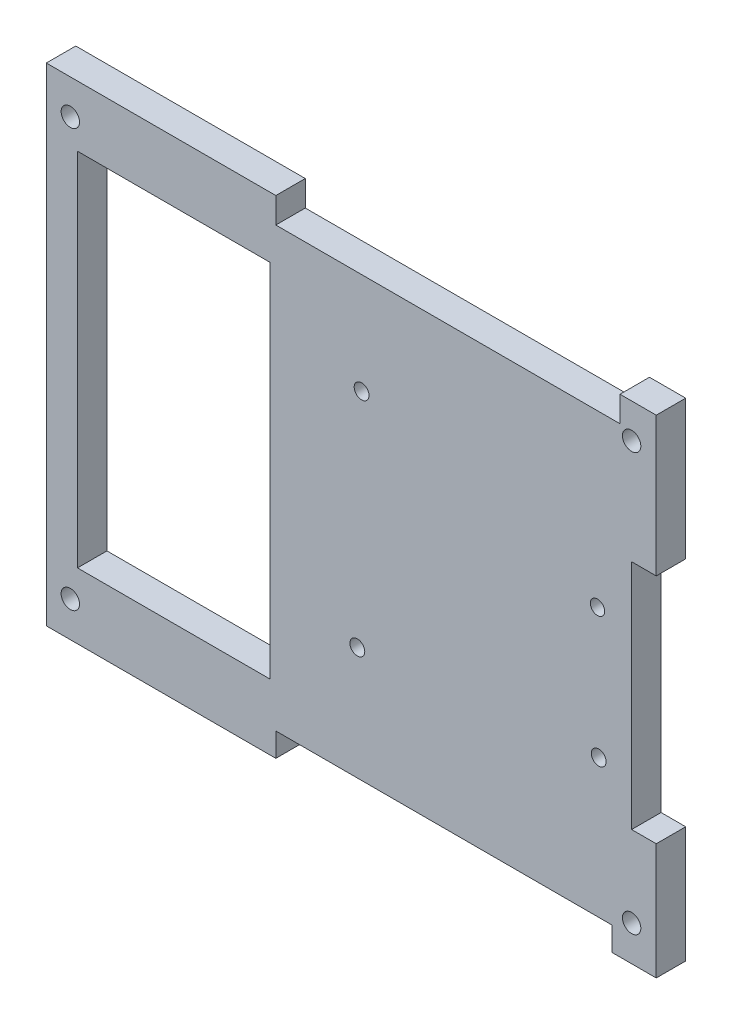
ISO-10303-21;
HEADER;
FILE_DESCRIPTION(('STEP AP214'),'2;1');
FILE_NAME('part.step','',(''),(''),'','','');
FILE_SCHEMA(('AUTOMOTIVE_DESIGN { 1 0 10303 214 1 1 1 1 }'));
ENDSEC;
DATA;
#1=APPLICATION_CONTEXT('core data for automotive mechanical design processes');
#2=APPLICATION_PROTOCOL_DEFINITION('international standard','automotive_design',2000,#1);
#3=PRODUCT_CONTEXT('',#1,'mechanical');
#4=PRODUCT('Part','Part','',(#3));
#5=PRODUCT_RELATED_PRODUCT_CATEGORY('part','',(#4));
#6=PRODUCT_DEFINITION_FORMATION('','',#4);
#7=PRODUCT_DEFINITION_CONTEXT('part definition',#1,'design');
#8=PRODUCT_DEFINITION('design','',#6,#7);
#9=PRODUCT_DEFINITION_SHAPE('','',#8);
#10=(LENGTH_UNIT() NAMED_UNIT(*) SI_UNIT(.MILLI.,.METRE.));
#11=(NAMED_UNIT(*) PLANE_ANGLE_UNIT() SI_UNIT($,.RADIAN.));
#12=(NAMED_UNIT(*) SI_UNIT($,.STERADIAN.) SOLID_ANGLE_UNIT());
#13=UNCERTAINTY_MEASURE_WITH_UNIT(LENGTH_MEASURE(1.E-05),#10,'distance_accuracy_value','');
#14=(GEOMETRIC_REPRESENTATION_CONTEXT(3) GLOBAL_UNCERTAINTY_ASSIGNED_CONTEXT((#13)) GLOBAL_UNIT_ASSIGNED_CONTEXT((#10,
#11,#12)) REPRESENTATION_CONTEXT('',''));
#15=CARTESIAN_POINT('',(0.,0.,0.));
#16=DIRECTION('',(0.,0.,1.));
#17=DIRECTION('',(1.,0.,0.));
#18=AXIS2_PLACEMENT_3D('',#15,#16,#17);
#19=CARTESIAN_POINT('',(418.178448875835,816.186975900284,1338.37384360341));
#20=DIRECTION('',(0.,1.,0.));
#21=DIRECTION('',(0.,0.,1.));
#22=AXIS2_PLACEMENT_3D('',#19,#20,#21);
#23=PLANE('',#22);
#24=DIRECTION('',(1.,0.,0.));
#25=VECTOR('',#24,1.);
#26=CARTESIAN_POINT('',(418.178448875835,816.186975900284,1338.37384360341));
#27=LINE('',#26,#25);
#28=CARTESIAN_POINT('',(540.159575683656,816.186975900284,1338.37384360341));
#29=VERTEX_POINT('',#28);
#30=CARTESIAN_POINT('',(549.669350228509,816.186975900284,1338.37384360341));
#31=VERTEX_POINT('',#30);
#32=EDGE_CURVE('E413',#29,#31,#27,.T.);
#33=ORIENTED_EDGE('',*,*,#32,.F.);
#34=DIRECTION('',(0.,0.,1.));
#35=VECTOR('',#34,1.);
#36=CARTESIAN_POINT('',(540.159575683656,816.186975900284,1332.02384360341));
#37=LINE('',#36,#35);
#38=CARTESIAN_POINT('',(540.159575683656,816.186975900284,1332.02384360341));
#39=VERTEX_POINT('',#38);
#40=EDGE_CURVE('E244',#39,#29,#37,.T.);
#41=ORIENTED_EDGE('',*,*,#40,.F.);
#42=DIRECTION('',(1.,0.,0.));
#43=VECTOR('',#42,1.);
#44=CARTESIAN_POINT('',(418.178448875835,816.186975900284,1332.02384360341));
#45=LINE('',#44,#43);
#46=CARTESIAN_POINT('',(549.669350228509,816.186975900284,1332.02384360341));
#47=VERTEX_POINT('',#46);
#48=EDGE_CURVE('E433',#39,#47,#45,.T.);
#49=ORIENTED_EDGE('',*,*,#48,.T.);
#50=DIRECTION('',(0.,0.,-1.));
#51=VECTOR('',#50,1.);
#52=CARTESIAN_POINT('',(549.669350228509,816.186975900284,1338.37384360341));
#53=LINE('',#52,#51);
#54=EDGE_CURVE('E54',#31,#47,#53,.T.);
#55=ORIENTED_EDGE('',*,*,#54,.F.);
#56=EDGE_LOOP('',(#33,#41,#49,#55));
#57=FACE_BOUND('',#56,.T.);
#58=ADVANCED_FACE('F45',(#57),#23,.F.);
#59=CARTESIAN_POINT('',(549.669350228509,921.270351797214,1338.37384360341));
#60=DIRECTION('',(-1.,0.,0.));
#61=DIRECTION('',(0.,0.,1.));
#62=AXIS2_PLACEMENT_3D('',#59,#60,#61);
#63=PLANE('',#62);
#64=DIRECTION('',(0.,1.,0.));
#65=VECTOR('',#64,1.);
#66=CARTESIAN_POINT('',(549.669350228509,921.270351797214,1332.02384360341));
#67=LINE('',#66,#65);
#68=CARTESIAN_POINT('',(549.669350228509,841.251573063495,1332.02384360341));
#69=VERTEX_POINT('',#68);
#70=EDGE_CURVE('E439',#47,#69,#67,.T.);
#71=ORIENTED_EDGE('',*,*,#70,.T.);
#72=DIRECTION('',(0.,0.,1.));
#73=VECTOR('',#72,1.);
#74=CARTESIAN_POINT('',(549.669350228509,841.251573063495,1332.02384360341));
#75=LINE('',#74,#73);
#76=CARTESIAN_POINT('',(549.669350228509,841.251573063495,1338.37384360341));
#77=VERTEX_POINT('',#76);
#78=EDGE_CURVE('E278',#69,#77,#75,.T.);
#79=ORIENTED_EDGE('',*,*,#78,.T.);
#80=DIRECTION('',(0.,1.,0.));
#81=VECTOR('',#80,1.);
#82=CARTESIAN_POINT('',(549.669350228509,921.270351797214,1338.37384360341));
#83=LINE('',#82,#81);
#84=EDGE_CURVE('E420',#31,#77,#83,.T.);
#85=ORIENTED_EDGE('',*,*,#84,.F.);
#86=ORIENTED_EDGE('',*,*,#54,.T.);
#87=EDGE_LOOP('',(#71,#79,#85,#86));
#88=FACE_BOUND('',#87,.T.);
#89=ADVANCED_FACE('F458',(#88),#63,.F.);
#90=CARTESIAN_POINT('',(418.178448875835,921.270351797214,1338.37384360341));
#91=DIRECTION('',(0.,-1.,0.));
#92=DIRECTION('',(0.,0.,-1.));
#93=AXIS2_PLACEMENT_3D('',#90,#91,#92);
#94=PLANE('',#93);
#95=DIRECTION('',(-1.,0.,0.));
#96=VECTOR('',#95,1.);
#97=CARTESIAN_POINT('',(418.178448875835,921.270351797214,1338.37384360341));
#98=LINE('',#97,#96);
#99=CARTESIAN_POINT('',(467.658620616941,921.270351797214,1338.37384360341));
#100=VERTEX_POINT('',#99);
#101=CARTESIAN_POINT('',(418.178448875835,921.270351797214,1338.37384360341));
#102=VERTEX_POINT('',#101);
#103=EDGE_CURVE('E424',#100,#102,#98,.T.);
#104=ORIENTED_EDGE('',*,*,#103,.F.);
#105=DIRECTION('',(0.,0.,1.));
#106=VECTOR('',#105,1.);
#107=CARTESIAN_POINT('',(467.658620616941,921.270351797214,1332.02384360341));
#108=LINE('',#107,#106);
#109=CARTESIAN_POINT('',(467.658620616941,921.270351797214,1332.02384360341));
#110=VERTEX_POINT('',#109);
#111=EDGE_CURVE('E224',#110,#100,#108,.T.);
#112=ORIENTED_EDGE('',*,*,#111,.F.);
#113=DIRECTION('',(-1.,0.,0.));
#114=VECTOR('',#113,1.);
#115=CARTESIAN_POINT('',(418.178448875835,921.270351797214,1332.02384360341));
#116=LINE('',#115,#114);
#117=CARTESIAN_POINT('',(418.178448875835,921.270351797214,1332.02384360341));
#118=VERTEX_POINT('',#117);
#119=EDGE_CURVE('E209',#110,#118,#116,.T.);
#120=ORIENTED_EDGE('',*,*,#119,.T.);
#121=DIRECTION('',(0.,0.,-1.));
#122=VECTOR('',#121,1.);
#123=CARTESIAN_POINT('',(418.178448875835,921.270351797214,1338.37384360341));
#124=LINE('',#123,#122);
#125=EDGE_CURVE('E429',#102,#118,#124,.T.);
#126=ORIENTED_EDGE('',*,*,#125,.F.);
#127=EDGE_LOOP('',(#104,#112,#120,#126));
#128=FACE_BOUND('',#127,.T.);
#129=ADVANCED_FACE('F494',(#128),#94,.F.);
#130=CARTESIAN_POINT('',(0.,0.,1338.37384360341));
#131=DIRECTION('',(0.,0.,1.));
#132=DIRECTION('',(1.,0.,0.));
#133=AXIS2_PLACEMENT_3D('',#130,#131,#132);
#134=PLANE('',#133);
#135=DIRECTION('',(0.,-1.,0.));
#136=VECTOR('',#135,1.);
#137=CARTESIAN_POINT('',(467.658620616941,921.270351797214,1338.37384360341));
#138=LINE('',#137,#136);
#139=CARTESIAN_POINT('',(467.658620616941,915.761022469148,1338.37384360341));
#140=VERTEX_POINT('',#139);
#141=EDGE_CURVE('E189',#100,#140,#138,.T.);
#142=ORIENTED_EDGE('',*,*,#141,.F.);
#143=ORIENTED_EDGE('',*,*,#103,.T.);
#144=DIRECTION('',(0.,-1.,0.));
#145=VECTOR('',#144,1.);
#146=CARTESIAN_POINT('',(418.178448875835,921.270351797214,1338.37384360341));
#147=LINE('',#146,#145);
#148=CARTESIAN_POINT('',(418.178448875835,816.186975900284,1338.37384360341));
#149=VERTEX_POINT('',#148);
#150=EDGE_CURVE('E409',#102,#149,#147,.T.);
#151=ORIENTED_EDGE('',*,*,#150,.T.);
#152=CARTESIAN_POINT('',(467.658063855424,816.186975900284,1338.37384360341));
#153=VERTEX_POINT('',#152);
#154=EDGE_CURVE('E415',#149,#153,#27,.T.);
#155=ORIENTED_EDGE('',*,*,#154,.T.);
#156=DIRECTION('',(0.,-1.,0.));
#157=VECTOR('',#156,1.);
#158=CARTESIAN_POINT('',(467.658063855424,816.186975900284,1338.37384360341));
#159=LINE('',#158,#157);
#160=CARTESIAN_POINT('',(467.658063855424,821.303733140852,1338.37384360341));
#161=VERTEX_POINT('',#160);
#162=EDGE_CURVE('E61',#161,#153,#159,.T.);
#163=ORIENTED_EDGE('',*,*,#162,.F.);
#164=DIRECTION('',(-1.,0.,0.));
#165=VECTOR('',#164,1.);
#166=CARTESIAN_POINT('',(540.159575683656,821.303733140852,1338.37384360341));
#167=LINE('',#166,#165);
#168=CARTESIAN_POINT('',(540.159575683656,821.303733140852,1338.37384360341));
#169=VERTEX_POINT('',#168);
#170=EDGE_CURVE('E250',#169,#161,#167,.T.);
#171=ORIENTED_EDGE('',*,*,#170,.F.);
#172=DIRECTION('',(0.,1.,0.));
#173=VECTOR('',#172,1.);
#174=CARTESIAN_POINT('',(540.159575683656,816.186975900284,1338.37384360341));
#175=LINE('',#174,#173);
#176=EDGE_CURVE('E221',#29,#169,#175,.T.);
#177=ORIENTED_EDGE('',*,*,#176,.F.);
#178=ORIENTED_EDGE('',*,*,#32,.T.);
#179=ORIENTED_EDGE('',*,*,#84,.T.);
#180=DIRECTION('',(1.,0.,0.));
#181=VECTOR('',#180,1.);
#182=CARTESIAN_POINT('',(549.669350228509,841.251573063495,1338.37384360341));
#183=LINE('',#182,#181);
#184=CARTESIAN_POINT('',(544.362409583412,841.251573063495,1338.37384360341));
#185=VERTEX_POINT('',#184);
#186=EDGE_CURVE('E282',#185,#77,#183,.T.);
#187=ORIENTED_EDGE('',*,*,#186,.F.);
#188=DIRECTION('',(0.,-1.,0.));
#189=VECTOR('',#188,1.);
#190=CARTESIAN_POINT('',(544.362409583412,891.254919125506,1338.37384360341));
#191=LINE('',#190,#189);
#192=CARTESIAN_POINT('',(544.362409583412,891.254919125506,1338.37384360341));
#193=VERTEX_POINT('',#192);
#194=EDGE_CURVE('E285',#193,#185,#191,.T.);
#195=ORIENTED_EDGE('',*,*,#194,.F.);
#196=DIRECTION('',(-1.,0.,0.));
#197=VECTOR('',#196,1.);
#198=CARTESIAN_POINT('',(549.669350228509,891.254919125506,1338.37384360341));
#199=LINE('',#198,#197);
#200=CARTESIAN_POINT('',(549.669350228509,891.254919125506,1338.37384360341));
#201=VERTEX_POINT('',#200);
#202=EDGE_CURVE('E247',#201,#193,#199,.T.);
#203=ORIENTED_EDGE('',*,*,#202,.F.);
#204=CARTESIAN_POINT('',(549.669350228509,921.270351797214,1338.37384360341));
#205=VERTEX_POINT('',#204);
#206=EDGE_CURVE('E419',#201,#205,#83,.T.);
#207=ORIENTED_EDGE('',*,*,#206,.T.);
#208=CARTESIAN_POINT('',(541.859742046903,921.270351797214,1338.37384360341));
#209=VERTEX_POINT('',#208);
#210=EDGE_CURVE('E425',#205,#209,#98,.T.);
#211=ORIENTED_EDGE('',*,*,#210,.T.);
#212=DIRECTION('',(0.,1.,0.));
#213=VECTOR('',#212,1.);
#214=CARTESIAN_POINT('',(541.859742046903,921.270351797214,1338.37384360341));
#215=LINE('',#214,#213);
#216=CARTESIAN_POINT('',(541.859742046903,915.761022469148,1338.37384360341));
#217=VERTEX_POINT('',#216);
#218=EDGE_CURVE('E211',#217,#209,#215,.T.);
#219=ORIENTED_EDGE('',*,*,#218,.F.);
#220=DIRECTION('',(1.,0.,0.));
#221=VECTOR('',#220,1.);
#222=CARTESIAN_POINT('',(467.658620616941,915.761022469148,1338.37384360341));
#223=LINE('',#222,#221);
#224=EDGE_CURVE('E214',#140,#217,#223,.T.);
#225=ORIENTED_EDGE('',*,*,#224,.F.);
#226=EDGE_LOOP('',(#142,#143,#151,#155,#163,#171,#177,#178,#179,#187,#195,#203,#207,#211,#219,#225));
#227=FACE_BOUND('',#226,.T.);
#228=DIRECTION('',(0.,1.,0.));
#229=VECTOR('',#228,1.);
#230=CARTESIAN_POINT('',(466.43603761745,908.167213591682,1338.37384360341));
#231=LINE('',#230,#229);
#232=CARTESIAN_POINT('',(466.43603761745,830.367055643005,1338.37384360341));
#233=VERTEX_POINT('',#232);
#234=CARTESIAN_POINT('',(466.43603761745,908.167213591682,1338.37384360341));
#235=VERTEX_POINT('',#234);
#236=EDGE_CURVE('E227',#233,#235,#231,.T.);
#237=ORIENTED_EDGE('',*,*,#236,.F.);
#238=DIRECTION('',(1.,0.,0.));
#239=VECTOR('',#238,1.);
#240=CARTESIAN_POINT('',(466.43603761745,830.367055643005,1338.37384360341));
#241=LINE('',#240,#239);
#242=CARTESIAN_POINT('',(424.903622471915,830.367055643005,1338.37384360341));
#243=VERTEX_POINT('',#242);
#244=EDGE_CURVE('E306',#243,#233,#241,.T.);
#245=ORIENTED_EDGE('',*,*,#244,.F.);
#246=DIRECTION('',(0.,-1.,0.));
#247=VECTOR('',#246,1.);
#248=CARTESIAN_POINT('',(424.903622471915,908.167213591682,1338.37384360341));
#249=LINE('',#248,#247);
#250=CARTESIAN_POINT('',(424.903622471915,908.167213591682,1338.37384360341));
#251=VERTEX_POINT('',#250);
#252=EDGE_CURVE('E325',#251,#243,#249,.T.);
#253=ORIENTED_EDGE('',*,*,#252,.F.);
#254=DIRECTION('',(-1.,0.,0.));
#255=VECTOR('',#254,1.);
#256=CARTESIAN_POINT('',(466.43603761745,908.167213591682,1338.37384360341));
#257=LINE('',#256,#255);
#258=EDGE_CURVE('E321',#235,#251,#257,.T.);
#259=ORIENTED_EDGE('',*,*,#258,.F.);
#260=EDGE_LOOP('',(#237,#245,#253,#259));
#261=FACE_BOUND('',#260,.T.);
#262=CARTESIAN_POINT('',(486.149027751431,893.958307233594,1338.37384360341));
#263=DIRECTION('',(0.,0.,1.));
#264=DIRECTION('',(1.,0.,0.));
#265=AXIS2_PLACEMENT_3D('',#262,#263,#264);
#266=CIRCLE('',#265,1.60000000000005);
#267=CARTESIAN_POINT('',(487.749027751431,893.958307233594,1338.37384360341));
#268=VERTEX_POINT('',#267);
#269=EDGE_CURVE('E350',#268,#268,#266,.T.);
#270=ORIENTED_EDGE('',*,*,#269,.F.);
#271=EDGE_LOOP('',(#270));
#272=FACE_BOUND('',#271,.T.);
#273=CARTESIAN_POINT('',(537.005692703363,879.063667595093,1338.37384360341));
#274=DIRECTION('',(0.,0.,1.));
#275=DIRECTION('',(1.,0.,0.));
#276=AXIS2_PLACEMENT_3D('',#273,#274,#275);
#277=CIRCLE('',#276,1.54077000260033);
#278=CARTESIAN_POINT('',(538.546462705964,879.063667595093,1338.37384360341));
#279=VERTEX_POINT('',#278);
#280=EDGE_CURVE('E354',#279,#279,#277,.T.);
#281=ORIENTED_EDGE('',*,*,#280,.F.);
#282=EDGE_LOOP('',(#281));
#283=FACE_BOUND('',#282,.T.);
#284=CARTESIAN_POINT('',(537.262931980679,851.150350094258,1338.37384360341));
#285=DIRECTION('',(0.,0.,1.));
#286=DIRECTION('',(1.,0.,0.));
#287=AXIS2_PLACEMENT_3D('',#284,#285,#286);
#288=CIRCLE('',#287,1.60000000000005);
#289=CARTESIAN_POINT('',(538.862931980679,851.150350094258,1338.37384360341));
#290=VERTEX_POINT('',#289);
#291=EDGE_CURVE('E362',#290,#290,#288,.T.);
#292=ORIENTED_EDGE('',*,*,#291,.F.);
#293=EDGE_LOOP('',(#292));
#294=FACE_BOUND('',#293,.T.);
#295=CARTESIAN_POINT('',(485.231408992538,845.690321199233,1338.37384360341));
#296=DIRECTION('',(0.,0.,1.));
#297=DIRECTION('',(1.,0.,0.));
#298=AXIS2_PLACEMENT_3D('',#295,#296,#297);
#299=CIRCLE('',#298,1.59999999999993);
#300=CARTESIAN_POINT('',(486.831408992538,845.690321199233,1338.37384360341));
#301=VERTEX_POINT('',#300);
#302=EDGE_CURVE('E370',#301,#301,#299,.T.);
#303=ORIENTED_EDGE('',*,*,#302,.F.);
#304=EDGE_LOOP('',(#303));
#305=FACE_BOUND('',#304,.T.);
#306=CARTESIAN_POINT('',(544.362409583412,823.802606664416,1338.37384360341));
#307=DIRECTION('',(0.,0.,1.));
#308=DIRECTION('',(1.,0.,0.));
#309=AXIS2_PLACEMENT_3D('',#306,#307,#308);
#310=CIRCLE('',#309,1.98119999999999);
#311=CARTESIAN_POINT('',(546.343609583412,823.802606664416,1338.37384360341));
#312=VERTEX_POINT('',#311);
#313=EDGE_CURVE('E385',#312,#312,#310,.T.);
#314=ORIENTED_EDGE('',*,*,#313,.F.);
#315=EDGE_LOOP('',(#314));
#316=FACE_BOUND('',#315,.T.);
#317=CARTESIAN_POINT('',(423.356809583412,913.820206664416,1338.37384360341));
#318=DIRECTION('',(0.,0.,1.));
#319=DIRECTION('',(1.,0.,0.));
#320=AXIS2_PLACEMENT_3D('',#317,#318,#319);
#321=CIRCLE('',#320,1.98119999999999);
#322=CARTESIAN_POINT('',(425.338009583412,913.820206664416,1338.37384360341));
#323=VERTEX_POINT('',#322);
#324=EDGE_CURVE('E401',#323,#323,#321,.T.);
#325=ORIENTED_EDGE('',*,*,#324,.F.);
#326=EDGE_LOOP('',(#325));
#327=FACE_BOUND('',#326,.T.);
#328=CARTESIAN_POINT('',(544.362409583412,913.820206664416,1338.37384360341));
#329=DIRECTION('',(0.,0.,1.));
#330=DIRECTION('',(1.,0.,0.));
#331=AXIS2_PLACEMENT_3D('',#328,#329,#330);
#332=CIRCLE('',#331,1.98119999999999);
#333=CARTESIAN_POINT('',(546.343609583412,913.820206664416,1338.37384360341));
#334=VERTEX_POINT('',#333);
#335=EDGE_CURVE('E393',#334,#334,#332,.T.);
#336=ORIENTED_EDGE('',*,*,#335,.F.);
#337=EDGE_LOOP('',(#336));
#338=FACE_BOUND('',#337,.T.);
#339=CARTESIAN_POINT('',(423.356809583412,823.802606664416,1338.37384360341));
#340=DIRECTION('',(0.,0.,1.));
#341=DIRECTION('',(1.,0.,0.));
#342=AXIS2_PLACEMENT_3D('',#339,#340,#341);
#343=CIRCLE('',#342,1.98119999999999);
#344=CARTESIAN_POINT('',(425.338009583412,823.802606664416,1338.37384360341));
#345=VERTEX_POINT('',#344);
#346=EDGE_CURVE('E377',#345,#345,#343,.T.);
#347=ORIENTED_EDGE('',*,*,#346,.F.);
#348=EDGE_LOOP('',(#347));
#349=FACE_BOUND('',#348,.T.);
#350=ADVANCED_FACE('F468',(#227,#261,#272,#283,#294,#305,#316,#327,#338,#349),#134,.T.);
#351=CARTESIAN_POINT('',(0.,0.,1332.02384360341));
#352=DIRECTION('',(0.,0.,1.));
#353=DIRECTION('',(1.,0.,0.));
#354=AXIS2_PLACEMENT_3D('',#351,#352,#353);
#355=PLANE('',#354);
#356=ORIENTED_EDGE('',*,*,#119,.F.);
#357=DIRECTION('',(0.,-1.,0.));
#358=VECTOR('',#357,1.);
#359=CARTESIAN_POINT('',(467.658620616941,921.270351797214,1332.02384360341));
#360=LINE('',#359,#358);
#361=CARTESIAN_POINT('',(467.658620616941,915.761022469148,1332.02384360341));
#362=VERTEX_POINT('',#361);
#363=EDGE_CURVE('E186',#110,#362,#360,.T.);
#364=ORIENTED_EDGE('',*,*,#363,.T.);
#365=DIRECTION('',(1.,0.,0.));
#366=VECTOR('',#365,1.);
#367=CARTESIAN_POINT('',(467.658620616941,915.761022469148,1332.02384360341));
#368=LINE('',#367,#366);
#369=CARTESIAN_POINT('',(541.859742046903,915.761022469148,1332.02384360341));
#370=VERTEX_POINT('',#369);
#371=EDGE_CURVE('E198',#362,#370,#368,.T.);
#372=ORIENTED_EDGE('',*,*,#371,.T.);
#373=DIRECTION('',(0.,1.,0.));
#374=VECTOR('',#373,1.);
#375=CARTESIAN_POINT('',(541.859742046903,921.270351797214,1332.02384360341));
#376=LINE('',#375,#374);
#377=CARTESIAN_POINT('',(541.859742046903,921.270351797214,1332.02384360341));
#378=VERTEX_POINT('',#377);
#379=EDGE_CURVE('E195',#370,#378,#376,.T.);
#380=ORIENTED_EDGE('',*,*,#379,.T.);
#381=CARTESIAN_POINT('',(549.669350228509,921.270351797214,1332.02384360341));
#382=VERTEX_POINT('',#381);
#383=EDGE_CURVE('E414',#382,#378,#116,.T.);
#384=ORIENTED_EDGE('',*,*,#383,.F.);
#385=CARTESIAN_POINT('',(549.669350228509,891.254919125506,1332.02384360341));
#386=VERTEX_POINT('',#385);
#387=EDGE_CURVE('E438',#386,#382,#67,.T.);
#388=ORIENTED_EDGE('',*,*,#387,.F.);
#389=DIRECTION('',(-1.,0.,0.));
#390=VECTOR('',#389,1.);
#391=CARTESIAN_POINT('',(549.669350228509,891.254919125506,1332.02384360341));
#392=LINE('',#391,#390);
#393=CARTESIAN_POINT('',(544.362409583412,891.254919125506,1332.02384360341));
#394=VERTEX_POINT('',#393);
#395=EDGE_CURVE('E69',#386,#394,#392,.T.);
#396=ORIENTED_EDGE('',*,*,#395,.T.);
#397=DIRECTION('',(0.,-1.,0.));
#398=VECTOR('',#397,1.);
#399=CARTESIAN_POINT('',(544.362409583412,891.254919125506,1332.02384360341));
#400=LINE('',#399,#398);
#401=CARTESIAN_POINT('',(544.362409583412,841.251573063495,1332.02384360341));
#402=VERTEX_POINT('',#401);
#403=EDGE_CURVE('E295',#394,#402,#400,.T.);
#404=ORIENTED_EDGE('',*,*,#403,.T.);
#405=DIRECTION('',(1.,0.,0.));
#406=VECTOR('',#405,1.);
#407=CARTESIAN_POINT('',(549.669350228509,841.251573063495,1332.02384360341));
#408=LINE('',#407,#406);
#409=EDGE_CURVE('E271',#402,#69,#408,.T.);
#410=ORIENTED_EDGE('',*,*,#409,.T.);
#411=ORIENTED_EDGE('',*,*,#70,.F.);
#412=ORIENTED_EDGE('',*,*,#48,.F.);
#413=DIRECTION('',(0.,1.,0.));
#414=VECTOR('',#413,1.);
#415=CARTESIAN_POINT('',(540.159575683656,816.186975900284,1332.02384360341));
#416=LINE('',#415,#414);
#417=CARTESIAN_POINT('',(540.159575683656,821.303733140852,1332.02384360341));
#418=VERTEX_POINT('',#417);
#419=EDGE_CURVE('E251',#39,#418,#416,.T.);
#420=ORIENTED_EDGE('',*,*,#419,.T.);
#421=DIRECTION('',(-1.,0.,0.));
#422=VECTOR('',#421,1.);
#423=CARTESIAN_POINT('',(540.159575683656,821.303733140852,1332.02384360341));
#424=LINE('',#423,#422);
#425=CARTESIAN_POINT('',(467.658063855424,821.303733140852,1332.02384360341));
#426=VERTEX_POINT('',#425);
#427=EDGE_CURVE('E261',#418,#426,#424,.T.);
#428=ORIENTED_EDGE('',*,*,#427,.T.);
#429=DIRECTION('',(0.,-1.,0.));
#430=VECTOR('',#429,1.);
#431=CARTESIAN_POINT('',(467.658063855424,816.186975900284,1332.02384360341));
#432=LINE('',#431,#430);
#433=CARTESIAN_POINT('',(467.658063855424,816.186975900284,1332.02384360341));
#434=VERTEX_POINT('',#433);
#435=EDGE_CURVE('E237',#426,#434,#432,.T.);
#436=ORIENTED_EDGE('',*,*,#435,.T.);
#437=CARTESIAN_POINT('',(418.178448875835,816.186975900284,1332.02384360341));
#438=VERTEX_POINT('',#437);
#439=EDGE_CURVE('E434',#438,#434,#45,.T.);
#440=ORIENTED_EDGE('',*,*,#439,.F.);
#441=DIRECTION('',(0.,-1.,0.));
#442=VECTOR('',#441,1.);
#443=CARTESIAN_POINT('',(418.178448875835,921.270351797214,1332.02384360341));
#444=LINE('',#443,#442);
#445=EDGE_CURVE('E405',#118,#438,#444,.T.);
#446=ORIENTED_EDGE('',*,*,#445,.F.);
#447=EDGE_LOOP('',(#356,#364,#372,#380,#384,#388,#396,#404,#410,#411,#412,#420,#428,#436,#440,#446));
#448=FACE_BOUND('',#447,.T.);
#449=DIRECTION('',(1.,0.,0.));
#450=VECTOR('',#449,1.);
#451=CARTESIAN_POINT('',(466.43603761745,830.367055643005,1332.02384360341));
#452=LINE('',#451,#450);
#453=CARTESIAN_POINT('',(424.903622471915,830.367055643005,1332.02384360341));
#454=VERTEX_POINT('',#453);
#455=CARTESIAN_POINT('',(466.43603761745,830.367055643005,1332.02384360341));
#456=VERTEX_POINT('',#455);
#457=EDGE_CURVE('E314',#454,#456,#452,.T.);
#458=ORIENTED_EDGE('',*,*,#457,.T.);
#459=DIRECTION('',(0.,1.,0.));
#460=VECTOR('',#459,1.);
#461=CARTESIAN_POINT('',(466.43603761745,908.167213591682,1332.02384360341));
#462=LINE('',#461,#460);
#463=CARTESIAN_POINT('',(466.43603761745,908.167213591682,1332.02384360341));
#464=VERTEX_POINT('',#463);
#465=EDGE_CURVE('E301',#456,#464,#462,.T.);
#466=ORIENTED_EDGE('',*,*,#465,.T.);
#467=DIRECTION('',(-1.,0.,0.));
#468=VECTOR('',#467,1.);
#469=CARTESIAN_POINT('',(466.43603761745,908.167213591682,1332.02384360341));
#470=LINE('',#469,#468);
#471=CARTESIAN_POINT('',(424.903622471915,908.167213591682,1332.02384360341));
#472=VERTEX_POINT('',#471);
#473=EDGE_CURVE('E305',#464,#472,#470,.T.);
#474=ORIENTED_EDGE('',*,*,#473,.T.);
#475=DIRECTION('',(0.,-1.,0.));
#476=VECTOR('',#475,1.);
#477=CARTESIAN_POINT('',(424.903622471915,908.167213591682,1332.02384360341));
#478=LINE('',#477,#476);
#479=EDGE_CURVE('E310',#472,#454,#478,.T.);
#480=ORIENTED_EDGE('',*,*,#479,.T.);
#481=EDGE_LOOP('',(#458,#466,#474,#480));
#482=FACE_BOUND('',#481,.T.);
#483=CARTESIAN_POINT('',(486.149027751431,893.958307233594,1332.02384360341));
#484=DIRECTION('',(0.,0.,1.));
#485=DIRECTION('',(1.,0.,0.));
#486=AXIS2_PLACEMENT_3D('',#483,#484,#485);
#487=CIRCLE('',#486,1.60000000000005);
#488=CARTESIAN_POINT('',(487.749027751431,893.958307233594,1332.02384360341));
#489=VERTEX_POINT('',#488);
#490=EDGE_CURVE('E345',#489,#489,#487,.T.);
#491=ORIENTED_EDGE('',*,*,#490,.T.);
#492=EDGE_LOOP('',(#491));
#493=FACE_BOUND('',#492,.T.);
#494=CARTESIAN_POINT('',(537.005692703363,879.063667595093,1332.02384360341));
#495=DIRECTION('',(0.,0.,1.));
#496=DIRECTION('',(1.,0.,0.));
#497=AXIS2_PLACEMENT_3D('',#494,#495,#496);
#498=CIRCLE('',#497,1.54077000260033);
#499=CARTESIAN_POINT('',(538.546462705964,879.063667595093,1332.02384360341));
#500=VERTEX_POINT('',#499);
#501=EDGE_CURVE('E358',#500,#500,#498,.T.);
#502=ORIENTED_EDGE('',*,*,#501,.T.);
#503=EDGE_LOOP('',(#502));
#504=FACE_BOUND('',#503,.T.);
#505=CARTESIAN_POINT('',(537.262931980679,851.150350094258,1332.02384360341));
#506=DIRECTION('',(0.,0.,1.));
#507=DIRECTION('',(1.,0.,0.));
#508=AXIS2_PLACEMENT_3D('',#505,#506,#507);
#509=CIRCLE('',#508,1.60000000000005);
#510=CARTESIAN_POINT('',(538.862931980679,851.150350094258,1332.02384360341));
#511=VERTEX_POINT('',#510);
#512=EDGE_CURVE('E366',#511,#511,#509,.T.);
#513=ORIENTED_EDGE('',*,*,#512,.T.);
#514=EDGE_LOOP('',(#513));
#515=FACE_BOUND('',#514,.T.);
#516=CARTESIAN_POINT('',(485.231408992538,845.690321199233,1332.02384360341));
#517=DIRECTION('',(0.,0.,1.));
#518=DIRECTION('',(1.,0.,0.));
#519=AXIS2_PLACEMENT_3D('',#516,#517,#518);
#520=CIRCLE('',#519,1.59999999999993);
#521=CARTESIAN_POINT('',(486.831408992538,845.690321199233,1332.02384360341));
#522=VERTEX_POINT('',#521);
#523=EDGE_CURVE('E335',#522,#522,#520,.T.);
#524=ORIENTED_EDGE('',*,*,#523,.T.);
#525=EDGE_LOOP('',(#524));
#526=FACE_BOUND('',#525,.T.);
#527=CARTESIAN_POINT('',(423.356809583412,913.820206664416,1332.02384360341));
#528=DIRECTION('',(0.,0.,1.));
#529=DIRECTION('',(1.,0.,0.));
#530=AXIS2_PLACEMENT_3D('',#527,#528,#529);
#531=CIRCLE('',#530,1.98119999999999);
#532=CARTESIAN_POINT('',(425.338009583412,913.820206664416,1332.02384360341));
#533=VERTEX_POINT('',#532);
#534=EDGE_CURVE('E397',#533,#533,#531,.T.);
#535=ORIENTED_EDGE('',*,*,#534,.T.);
#536=EDGE_LOOP('',(#535));
#537=FACE_BOUND('',#536,.T.);
#538=CARTESIAN_POINT('',(544.362409583412,913.820206664416,1332.02384360341));
#539=DIRECTION('',(0.,0.,1.));
#540=DIRECTION('',(1.,0.,0.));
#541=AXIS2_PLACEMENT_3D('',#538,#539,#540);
#542=CIRCLE('',#541,1.98119999999999);
#543=CARTESIAN_POINT('',(546.343609583412,913.820206664416,1332.02384360341));
#544=VERTEX_POINT('',#543);
#545=EDGE_CURVE('E389',#544,#544,#542,.T.);
#546=ORIENTED_EDGE('',*,*,#545,.T.);
#547=EDGE_LOOP('',(#546));
#548=FACE_BOUND('',#547,.T.);
#549=CARTESIAN_POINT('',(544.362409583412,823.802606664416,1332.02384360341));
#550=DIRECTION('',(0.,0.,1.));
#551=DIRECTION('',(1.,0.,0.));
#552=AXIS2_PLACEMENT_3D('',#549,#550,#551);
#553=CIRCLE('',#552,1.98119999999999);
#554=CARTESIAN_POINT('',(546.343609583412,823.802606664416,1332.02384360341));
#555=VERTEX_POINT('',#554);
#556=EDGE_CURVE('E381',#555,#555,#553,.T.);
#557=ORIENTED_EDGE('',*,*,#556,.T.);
#558=EDGE_LOOP('',(#557));
#559=FACE_BOUND('',#558,.T.);
#560=CARTESIAN_POINT('',(423.356809583412,823.802606664416,1332.02384360341));
#561=DIRECTION('',(0.,0.,1.));
#562=DIRECTION('',(1.,0.,0.));
#563=AXIS2_PLACEMENT_3D('',#560,#561,#562);
#564=CIRCLE('',#563,1.98119999999999);
#565=CARTESIAN_POINT('',(425.338009583412,823.802606664416,1332.02384360341));
#566=VERTEX_POINT('',#565);
#567=EDGE_CURVE('E349',#566,#566,#564,.T.);
#568=ORIENTED_EDGE('',*,*,#567,.T.);
#569=EDGE_LOOP('',(#568));
#570=FACE_BOUND('',#569,.T.);
#571=ADVANCED_FACE('F206',(#448,#482,#493,#504,#515,#526,#537,#548,#559,#570),#355,.F.);
#572=CARTESIAN_POINT('',(418.178448875835,921.270351797214,1338.37384360341));
#573=DIRECTION('',(1.,0.,0.));
#574=DIRECTION('',(0.,0.,-1.));
#575=AXIS2_PLACEMENT_3D('',#572,#573,#574);
#576=PLANE('',#575);
#577=ORIENTED_EDGE('',*,*,#445,.T.);
#578=DIRECTION('',(0.,0.,-1.));
#579=VECTOR('',#578,1.);
#580=CARTESIAN_POINT('',(418.178448875835,816.186975900284,1338.37384360341));
#581=LINE('',#580,#579);
#582=EDGE_CURVE('E11',#149,#438,#581,.T.);
#583=ORIENTED_EDGE('',*,*,#582,.F.);
#584=ORIENTED_EDGE('',*,*,#150,.F.);
#585=ORIENTED_EDGE('',*,*,#125,.T.);
#586=EDGE_LOOP('',(#577,#583,#584,#585));
#587=FACE_BOUND('',#586,.T.);
#588=ADVANCED_FACE('F47',(#587),#576,.F.);
#589=ORIENTED_EDGE('',*,*,#439,.T.);
#590=DIRECTION('',(0.,0.,1.));
#591=VECTOR('',#590,1.);
#592=CARTESIAN_POINT('',(467.658063855424,816.186975900284,1332.02384360341));
#593=LINE('',#592,#591);
#594=EDGE_CURVE('E241',#434,#153,#593,.T.);
#595=ORIENTED_EDGE('',*,*,#594,.T.);
#596=ORIENTED_EDGE('',*,*,#154,.F.);
#597=ORIENTED_EDGE('',*,*,#582,.T.);
#598=EDGE_LOOP('',(#589,#595,#596,#597));
#599=FACE_BOUND('',#598,.T.);
#600=ADVANCED_FACE('F487',(#599),#23,.F.);
#601=ORIENTED_EDGE('',*,*,#206,.F.);
#602=DIRECTION('',(0.,0.,1.));
#603=VECTOR('',#602,1.);
#604=CARTESIAN_POINT('',(549.669350228509,891.254919125506,1332.02384360341));
#605=LINE('',#604,#603);
#606=EDGE_CURVE('E268',#386,#201,#605,.T.);
#607=ORIENTED_EDGE('',*,*,#606,.F.);
#608=ORIENTED_EDGE('',*,*,#387,.T.);
#609=DIRECTION('',(0.,0.,-1.));
#610=VECTOR('',#609,1.);
#611=CARTESIAN_POINT('',(549.669350228509,921.270351797214,1338.37384360341));
#612=LINE('',#611,#610);
#613=EDGE_CURVE('E449',#205,#382,#612,.T.);
#614=ORIENTED_EDGE('',*,*,#613,.F.);
#615=EDGE_LOOP('',(#601,#607,#608,#614));
#616=FACE_BOUND('',#615,.T.);
#617=ADVANCED_FACE('F506',(#616),#63,.F.);
#618=ORIENTED_EDGE('',*,*,#383,.T.);
#619=DIRECTION('',(0.,0.,1.));
#620=VECTOR('',#619,1.);
#621=CARTESIAN_POINT('',(541.859742046903,921.270351797214,1332.02384360341));
#622=LINE('',#621,#620);
#623=EDGE_CURVE('E228',#378,#209,#622,.T.);
#624=ORIENTED_EDGE('',*,*,#623,.T.);
#625=ORIENTED_EDGE('',*,*,#210,.F.);
#626=ORIENTED_EDGE('',*,*,#613,.T.);
#627=EDGE_LOOP('',(#618,#624,#625,#626));
#628=FACE_BOUND('',#627,.T.);
#629=ADVANCED_FACE('F500',(#628),#94,.F.);
#630=CARTESIAN_POINT('',(423.356809583412,913.820206664416,1338.37384360341));
#631=DIRECTION('',(0.,0.,-1.));
#632=DIRECTION('',(-1.,0.,0.));
#633=AXIS2_PLACEMENT_3D('',#630,#631,#632);
#634=CYLINDRICAL_SURFACE('',#633,1.98119999999999);
#635=ORIENTED_EDGE('',*,*,#324,.T.);
#636=EDGE_LOOP('',(#635));
#637=FACE_BOUND('',#636,.T.);
#638=ORIENTED_EDGE('',*,*,#534,.F.);
#639=EDGE_LOOP('',(#638));
#640=FACE_BOUND('',#639,.T.);
#641=ADVANCED_FACE('F542',(#637,#640),#634,.F.);
#642=CARTESIAN_POINT('',(544.362409583412,913.820206664416,1338.37384360341));
#643=DIRECTION('',(0.,0.,-1.));
#644=DIRECTION('',(-1.,0.,0.));
#645=AXIS2_PLACEMENT_3D('',#642,#643,#644);
#646=CYLINDRICAL_SURFACE('',#645,1.98119999999999);
#647=ORIENTED_EDGE('',*,*,#335,.T.);
#648=EDGE_LOOP('',(#647));
#649=FACE_BOUND('',#648,.T.);
#650=ORIENTED_EDGE('',*,*,#545,.F.);
#651=EDGE_LOOP('',(#650));
#652=FACE_BOUND('',#651,.T.);
#653=ADVANCED_FACE('F546',(#649,#652),#646,.F.);
#654=CARTESIAN_POINT('',(544.362409583412,823.802606664416,1338.37384360341));
#655=DIRECTION('',(0.,0.,-1.));
#656=DIRECTION('',(-1.,0.,0.));
#657=AXIS2_PLACEMENT_3D('',#654,#655,#656);
#658=CYLINDRICAL_SURFACE('',#657,1.98119999999999);
#659=ORIENTED_EDGE('',*,*,#313,.T.);
#660=EDGE_LOOP('',(#659));
#661=FACE_BOUND('',#660,.T.);
#662=ORIENTED_EDGE('',*,*,#556,.F.);
#663=EDGE_LOOP('',(#662));
#664=FACE_BOUND('',#663,.T.);
#665=ADVANCED_FACE('F596',(#661,#664),#658,.F.);
#666=CARTESIAN_POINT('',(423.356809583412,823.802606664416,1338.37384360341));
#667=DIRECTION('',(0.,0.,-1.));
#668=DIRECTION('',(-1.,0.,0.));
#669=AXIS2_PLACEMENT_3D('',#666,#667,#668);
#670=CYLINDRICAL_SURFACE('',#669,1.98119999999999);
#671=ORIENTED_EDGE('',*,*,#346,.T.);
#672=EDGE_LOOP('',(#671));
#673=FACE_BOUND('',#672,.T.);
#674=ORIENTED_EDGE('',*,*,#567,.F.);
#675=EDGE_LOOP('',(#674));
#676=FACE_BOUND('',#675,.T.);
#677=ADVANCED_FACE('F606',(#673,#676),#670,.F.);
#678=CARTESIAN_POINT('',(485.231408992538,845.690321199233,1332.02384360341));
#679=DIRECTION('',(0.,0.,1.));
#680=DIRECTION('',(1.,0.,0.));
#681=AXIS2_PLACEMENT_3D('',#678,#679,#680);
#682=CYLINDRICAL_SURFACE('',#681,1.59999999999993);
#683=ORIENTED_EDGE('',*,*,#523,.F.);
#684=EDGE_LOOP('',(#683));
#685=FACE_BOUND('',#684,.T.);
#686=ORIENTED_EDGE('',*,*,#302,.T.);
#687=EDGE_LOOP('',(#686));
#688=FACE_BOUND('',#687,.T.);
#689=ADVANCED_FACE('F616',(#685,#688),#682,.F.);
#690=CARTESIAN_POINT('',(537.262931980679,851.150350094258,1332.02384360341));
#691=DIRECTION('',(0.,0.,1.));
#692=DIRECTION('',(1.,0.,0.));
#693=AXIS2_PLACEMENT_3D('',#690,#691,#692);
#694=CYLINDRICAL_SURFACE('',#693,1.60000000000005);
#695=ORIENTED_EDGE('',*,*,#512,.F.);
#696=EDGE_LOOP('',(#695));
#697=FACE_BOUND('',#696,.T.);
#698=ORIENTED_EDGE('',*,*,#291,.T.);
#699=EDGE_LOOP('',(#698));
#700=FACE_BOUND('',#699,.T.);
#701=ADVANCED_FACE('F626',(#697,#700),#694,.F.);
#702=CARTESIAN_POINT('',(537.005692703363,879.063667595093,1332.02384360341));
#703=DIRECTION('',(0.,0.,1.));
#704=DIRECTION('',(1.,0.,0.));
#705=AXIS2_PLACEMENT_3D('',#702,#703,#704);
#706=CYLINDRICAL_SURFACE('',#705,1.54077000260033);
#707=ORIENTED_EDGE('',*,*,#501,.F.);
#708=EDGE_LOOP('',(#707));
#709=FACE_BOUND('',#708,.T.);
#710=ORIENTED_EDGE('',*,*,#280,.T.);
#711=EDGE_LOOP('',(#710));
#712=FACE_BOUND('',#711,.T.);
#713=ADVANCED_FACE('F636',(#709,#712),#706,.F.);
#714=CARTESIAN_POINT('',(486.149027751431,893.958307233594,1332.02384360341));
#715=DIRECTION('',(0.,0.,1.));
#716=DIRECTION('',(1.,0.,0.));
#717=AXIS2_PLACEMENT_3D('',#714,#715,#716);
#718=CYLINDRICAL_SURFACE('',#717,1.60000000000005);
#719=ORIENTED_EDGE('',*,*,#490,.F.);
#720=EDGE_LOOP('',(#719));
#721=FACE_BOUND('',#720,.T.);
#722=ORIENTED_EDGE('',*,*,#269,.T.);
#723=EDGE_LOOP('',(#722));
#724=FACE_BOUND('',#723,.T.);
#725=ADVANCED_FACE('F646',(#721,#724),#718,.F.);
#726=CARTESIAN_POINT('',(466.43603761745,908.167213591682,1332.02384360341));
#727=DIRECTION('',(1.,0.,0.));
#728=DIRECTION('',(0.,0.,-1.));
#729=AXIS2_PLACEMENT_3D('',#726,#727,#728);
#730=PLANE('',#729);
#731=ORIENTED_EDGE('',*,*,#236,.T.);
#732=DIRECTION('',(0.,0.,1.));
#733=VECTOR('',#732,1.);
#734=CARTESIAN_POINT('',(466.43603761745,908.167213591682,1332.02384360341));
#735=LINE('',#734,#733);
#736=EDGE_CURVE('E318',#464,#235,#735,.T.);
#737=ORIENTED_EDGE('',*,*,#736,.F.);
#738=ORIENTED_EDGE('',*,*,#465,.F.);
#739=DIRECTION('',(0.,0.,1.));
#740=VECTOR('',#739,1.);
#741=CARTESIAN_POINT('',(466.43603761745,830.367055643005,1332.02384360341));
#742=LINE('',#741,#740);
#743=EDGE_CURVE('E332',#456,#233,#742,.T.);
#744=ORIENTED_EDGE('',*,*,#743,.T.);
#745=EDGE_LOOP('',(#731,#737,#738,#744));
#746=FACE_BOUND('',#745,.T.);
#747=ADVANCED_FACE('F656',(#746),#730,.F.);
#748=CARTESIAN_POINT('',(466.43603761745,830.367055643005,1332.02384360341));
#749=DIRECTION('',(0.,-1.,0.));
#750=DIRECTION('',(0.,0.,-1.));
#751=AXIS2_PLACEMENT_3D('',#748,#749,#750);
#752=PLANE('',#751);
#753=ORIENTED_EDGE('',*,*,#244,.T.);
#754=ORIENTED_EDGE('',*,*,#743,.F.);
#755=ORIENTED_EDGE('',*,*,#457,.F.);
#756=DIRECTION('',(0.,0.,1.));
#757=VECTOR('',#756,1.);
#758=CARTESIAN_POINT('',(424.903622471915,830.367055643005,1332.02384360341));
#759=LINE('',#758,#757);
#760=EDGE_CURVE('E336',#454,#243,#759,.T.);
#761=ORIENTED_EDGE('',*,*,#760,.T.);
#762=EDGE_LOOP('',(#753,#754,#755,#761));
#763=FACE_BOUND('',#762,.T.);
#764=ADVANCED_FACE('F666',(#763),#752,.F.);
#765=CARTESIAN_POINT('',(424.903622471915,908.167213591682,1332.02384360341));
#766=DIRECTION('',(-1.,0.,0.));
#767=DIRECTION('',(0.,0.,1.));
#768=AXIS2_PLACEMENT_3D('',#765,#766,#767);
#769=PLANE('',#768);
#770=ORIENTED_EDGE('',*,*,#252,.T.);
#771=ORIENTED_EDGE('',*,*,#760,.F.);
#772=ORIENTED_EDGE('',*,*,#479,.F.);
#773=DIRECTION('',(0.,0.,1.));
#774=VECTOR('',#773,1.);
#775=CARTESIAN_POINT('',(424.903622471915,908.167213591682,1332.02384360341));
#776=LINE('',#775,#774);
#777=EDGE_CURVE('E339',#472,#251,#776,.T.);
#778=ORIENTED_EDGE('',*,*,#777,.T.);
#779=EDGE_LOOP('',(#770,#771,#772,#778));
#780=FACE_BOUND('',#779,.T.);
#781=ADVANCED_FACE('F676',(#780),#769,.F.);
#782=CARTESIAN_POINT('',(466.43603761745,908.167213591682,1332.02384360341));
#783=DIRECTION('',(0.,1.,0.));
#784=DIRECTION('',(0.,0.,1.));
#785=AXIS2_PLACEMENT_3D('',#782,#783,#784);
#786=PLANE('',#785);
#787=ORIENTED_EDGE('',*,*,#258,.T.);
#788=ORIENTED_EDGE('',*,*,#777,.F.);
#789=ORIENTED_EDGE('',*,*,#473,.F.);
#790=ORIENTED_EDGE('',*,*,#736,.T.);
#791=EDGE_LOOP('',(#787,#788,#789,#790));
#792=FACE_BOUND('',#791,.T.);
#793=ADVANCED_FACE('F686',(#792),#786,.F.);
#794=CARTESIAN_POINT('',(467.658620616941,921.270351797214,1332.02384360341));
#795=DIRECTION('',(-1.,0.,0.));
#796=DIRECTION('',(0.,0.,1.));
#797=AXIS2_PLACEMENT_3D('',#794,#795,#796);
#798=PLANE('',#797);
#799=ORIENTED_EDGE('',*,*,#141,.T.);
#800=DIRECTION('',(0.,0.,1.));
#801=VECTOR('',#800,1.);
#802=CARTESIAN_POINT('',(467.658620616941,915.761022469148,1332.02384360341));
#803=LINE('',#802,#801);
#804=EDGE_CURVE('E182',#362,#140,#803,.T.);
#805=ORIENTED_EDGE('',*,*,#804,.F.);
#806=ORIENTED_EDGE('',*,*,#363,.F.);
#807=ORIENTED_EDGE('',*,*,#111,.T.);
#808=EDGE_LOOP('',(#799,#805,#806,#807));
#809=FACE_BOUND('',#808,.T.);
#810=ADVANCED_FACE('F184',(#809),#798,.F.);
#811=CARTESIAN_POINT('',(541.859742046903,921.270351797214,1332.02384360341));
#812=DIRECTION('',(1.,0.,0.));
#813=DIRECTION('',(0.,0.,-1.));
#814=AXIS2_PLACEMENT_3D('',#811,#812,#813);
#815=PLANE('',#814);
#816=ORIENTED_EDGE('',*,*,#218,.T.);
#817=ORIENTED_EDGE('',*,*,#623,.F.);
#818=ORIENTED_EDGE('',*,*,#379,.F.);
#819=DIRECTION('',(0.,0.,1.));
#820=VECTOR('',#819,1.);
#821=CARTESIAN_POINT('',(541.859742046903,915.761022469148,1332.02384360341));
#822=LINE('',#821,#820);
#823=EDGE_CURVE('E194',#370,#217,#822,.T.);
#824=ORIENTED_EDGE('',*,*,#823,.T.);
#825=EDGE_LOOP('',(#816,#817,#818,#824));
#826=FACE_BOUND('',#825,.T.);
#827=ADVANCED_FACE('F498',(#826),#815,.F.);
#828=CARTESIAN_POINT('',(467.658620616941,915.761022469148,1332.02384360341));
#829=DIRECTION('',(0.,-1.,0.));
#830=DIRECTION('',(0.,0.,-1.));
#831=AXIS2_PLACEMENT_3D('',#828,#829,#830);
#832=PLANE('',#831);
#833=ORIENTED_EDGE('',*,*,#224,.T.);
#834=ORIENTED_EDGE('',*,*,#823,.F.);
#835=ORIENTED_EDGE('',*,*,#371,.F.);
#836=ORIENTED_EDGE('',*,*,#804,.T.);
#837=EDGE_LOOP('',(#833,#834,#835,#836));
#838=FACE_BOUND('',#837,.T.);
#839=ADVANCED_FACE('F199',(#838),#832,.F.);
#840=CARTESIAN_POINT('',(549.669350228509,841.251573063495,1332.02384360341));
#841=DIRECTION('',(0.,-1.,0.));
#842=DIRECTION('',(0.,0.,-1.));
#843=AXIS2_PLACEMENT_3D('',#840,#841,#842);
#844=PLANE('',#843);
#845=ORIENTED_EDGE('',*,*,#186,.T.);
#846=ORIENTED_EDGE('',*,*,#78,.F.);
#847=ORIENTED_EDGE('',*,*,#409,.F.);
#848=DIRECTION('',(0.,0.,1.));
#849=VECTOR('',#848,1.);
#850=CARTESIAN_POINT('',(544.362409583412,841.251573063495,1332.02384360341));
#851=LINE('',#850,#849);
#852=EDGE_CURVE('E275',#402,#185,#851,.T.);
#853=ORIENTED_EDGE('',*,*,#852,.T.);
#854=EDGE_LOOP('',(#845,#846,#847,#853));
#855=FACE_BOUND('',#854,.T.);
#856=ADVANCED_FACE('F465',(#855),#844,.F.);
#857=CARTESIAN_POINT('',(544.362409583412,891.254919125506,1332.02384360341));
#858=DIRECTION('',(-1.,0.,0.));
#859=DIRECTION('',(0.,0.,1.));
#860=AXIS2_PLACEMENT_3D('',#857,#858,#859);
#861=PLANE('',#860);
#862=ORIENTED_EDGE('',*,*,#194,.T.);
#863=ORIENTED_EDGE('',*,*,#852,.F.);
#864=ORIENTED_EDGE('',*,*,#403,.F.);
#865=DIRECTION('',(0.,0.,1.));
#866=VECTOR('',#865,1.);
#867=CARTESIAN_POINT('',(544.362409583412,891.254919125506,1332.02384360341));
#868=LINE('',#867,#866);
#869=EDGE_CURVE('E272',#394,#193,#868,.T.);
#870=ORIENTED_EDGE('',*,*,#869,.T.);
#871=EDGE_LOOP('',(#862,#863,#864,#870));
#872=FACE_BOUND('',#871,.T.);
#873=ADVANCED_FACE('F510',(#872),#861,.F.);
#874=CARTESIAN_POINT('',(549.669350228509,891.254919125506,1332.02384360341));
#875=DIRECTION('',(0.,1.,0.));
#876=DIRECTION('',(0.,0.,1.));
#877=AXIS2_PLACEMENT_3D('',#874,#875,#876);
#878=PLANE('',#877);
#879=ORIENTED_EDGE('',*,*,#202,.T.);
#880=ORIENTED_EDGE('',*,*,#869,.F.);
#881=ORIENTED_EDGE('',*,*,#395,.F.);
#882=ORIENTED_EDGE('',*,*,#606,.T.);
#883=EDGE_LOOP('',(#879,#880,#881,#882));
#884=FACE_BOUND('',#883,.T.);
#885=ADVANCED_FACE('F508',(#884),#878,.F.);
#886=CARTESIAN_POINT('',(540.159575683656,816.186975900284,1332.02384360341));
#887=DIRECTION('',(1.,0.,0.));
#888=DIRECTION('',(0.,0.,-1.));
#889=AXIS2_PLACEMENT_3D('',#886,#887,#888);
#890=PLANE('',#889);
#891=ORIENTED_EDGE('',*,*,#176,.T.);
#892=DIRECTION('',(0.,0.,1.));
#893=VECTOR('',#892,1.);
#894=CARTESIAN_POINT('',(540.159575683656,821.303733140852,1332.02384360341));
#895=LINE('',#894,#893);
#896=EDGE_CURVE('E234',#418,#169,#895,.T.);
#897=ORIENTED_EDGE('',*,*,#896,.F.);
#898=ORIENTED_EDGE('',*,*,#419,.F.);
#899=ORIENTED_EDGE('',*,*,#40,.T.);
#900=EDGE_LOOP('',(#891,#897,#898,#899));
#901=FACE_BOUND('',#900,.T.);
#902=ADVANCED_FACE('F480',(#901),#890,.F.);
#903=CARTESIAN_POINT('',(467.658063855424,816.186975900284,1332.02384360341));
#904=DIRECTION('',(-1.,0.,0.));
#905=DIRECTION('',(0.,0.,1.));
#906=AXIS2_PLACEMENT_3D('',#903,#904,#905);
#907=PLANE('',#906);
#908=ORIENTED_EDGE('',*,*,#162,.T.);
#909=ORIENTED_EDGE('',*,*,#594,.F.);
#910=ORIENTED_EDGE('',*,*,#435,.F.);
#911=DIRECTION('',(0.,0.,1.));
#912=VECTOR('',#911,1.);
#913=CARTESIAN_POINT('',(467.658063855424,821.303733140852,1332.02384360341));
#914=LINE('',#913,#912);
#915=EDGE_CURVE('E238',#426,#161,#914,.T.);
#916=ORIENTED_EDGE('',*,*,#915,.T.);
#917=EDGE_LOOP('',(#908,#909,#910,#916));
#918=FACE_BOUND('',#917,.T.);
#919=ADVANCED_FACE('F485',(#918),#907,.F.);
#920=CARTESIAN_POINT('',(540.159575683656,821.303733140852,1332.02384360341));
#921=DIRECTION('',(0.,1.,0.));
#922=DIRECTION('',(0.,0.,1.));
#923=AXIS2_PLACEMENT_3D('',#920,#921,#922);
#924=PLANE('',#923);
#925=ORIENTED_EDGE('',*,*,#170,.T.);
#926=ORIENTED_EDGE('',*,*,#915,.F.);
#927=ORIENTED_EDGE('',*,*,#427,.F.);
#928=ORIENTED_EDGE('',*,*,#896,.T.);
#929=EDGE_LOOP('',(#925,#926,#927,#928));
#930=FACE_BOUND('',#929,.T.);
#931=ADVANCED_FACE('F484',(#930),#924,.F.);
#932=CLOSED_SHELL('',(#58,#89,#129,#350,#571,#588,#600,#617,#629,#641,#653,#665,#677,#689,#701,
#713,#725,#747,#764,#781,#793,#810,#827,#839,#856,#873,#885,#902,#919,#931));
#933=MANIFOLD_SOLID_BREP('B2',#932);
#934=ADVANCED_BREP_SHAPE_REPRESENTATION('',(#18,#933),#14);
#935=SHAPE_DEFINITION_REPRESENTATION(#9,#934);
ENDSEC;
END-ISO-10303-21;
